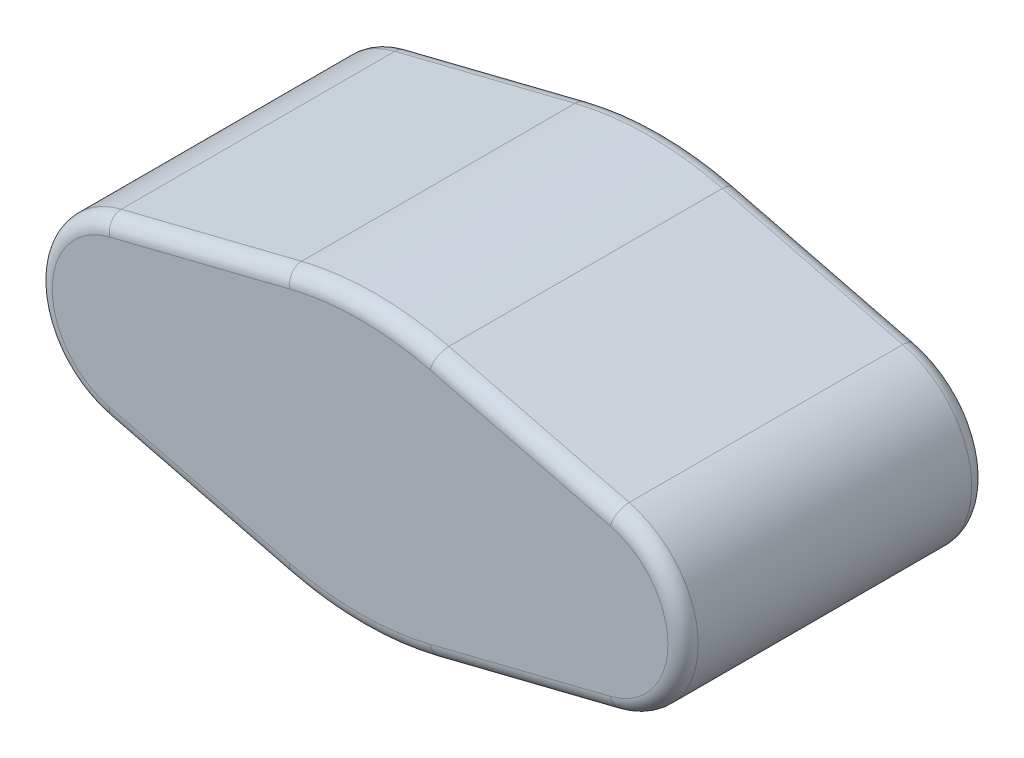
ISO-10303-21;
HEADER;
FILE_DESCRIPTION(('STEP AP214'),'2;1');
FILE_NAME('part.step','',(''),(''),'','','');
FILE_SCHEMA(('AUTOMOTIVE_DESIGN { 1 0 10303 214 1 1 1 1 }'));
ENDSEC;
DATA;
#1=APPLICATION_CONTEXT('core data for automotive mechanical design processes');
#2=APPLICATION_PROTOCOL_DEFINITION('international standard','automotive_design',2000,#1);
#3=PRODUCT_CONTEXT('',#1,'mechanical');
#4=PRODUCT('Part','Part','',(#3));
#5=PRODUCT_RELATED_PRODUCT_CATEGORY('part','',(#4));
#6=PRODUCT_DEFINITION_FORMATION('','',#4);
#7=PRODUCT_DEFINITION_CONTEXT('part definition',#1,'design');
#8=PRODUCT_DEFINITION('design','',#6,#7);
#9=PRODUCT_DEFINITION_SHAPE('','',#8);
#10=(LENGTH_UNIT() NAMED_UNIT(*) SI_UNIT(.MILLI.,.METRE.));
#11=(NAMED_UNIT(*) PLANE_ANGLE_UNIT() SI_UNIT($,.RADIAN.));
#12=(NAMED_UNIT(*) SI_UNIT($,.STERADIAN.) SOLID_ANGLE_UNIT());
#13=UNCERTAINTY_MEASURE_WITH_UNIT(LENGTH_MEASURE(1.E-05),#10,'distance_accuracy_value','');
#14=(GEOMETRIC_REPRESENTATION_CONTEXT(3) GLOBAL_UNCERTAINTY_ASSIGNED_CONTEXT((#13)) GLOBAL_UNIT_ASSIGNED_CONTEXT((#10,
#11,#12)) REPRESENTATION_CONTEXT('',''));
#15=CARTESIAN_POINT('',(0.,0.,0.));
#16=DIRECTION('',(0.,0.,1.));
#17=DIRECTION('',(1.,0.,0.));
#18=AXIS2_PLACEMENT_3D('',#15,#16,#17);
#19=CARTESIAN_POINT('',(0.,0.,0.));
#20=DIRECTION('',(0.,0.,1.));
#21=DIRECTION('',(1.,0.,0.));
#22=AXIS2_PLACEMENT_3D('',#19,#20,#21);
#23=PLANE('',#22);
#24=DIRECTION('',(-0.970142500145332,0.242535625036333,0.));
#25=VECTOR('',#24,1.);
#26=CARTESIAN_POINT('',(-0.121267812518166,-0.485071250072665,0.));
#27=LINE('',#26,#25);
#28=CARTESIAN_POINT('',(2.30408843784516,-1.0914103126635,0.));
#29=VERTEX_POINT('',#28);
#30=CARTESIAN_POINT('',(8.23702218573785,-2.57464374963667,0.));
#31=VERTEX_POINT('',#30);
#32=EDGE_CURVE('E153',#29,#31,#27,.F.);
#33=ORIENTED_EDGE('',*,*,#32,.T.);
#34=CARTESIAN_POINT('',(7.63068312314702,-5.,0.));
#35=DIRECTION('',(0.,0.,1.));
#36=DIRECTION('',(1.,0.,0.));
#37=AXIS2_PLACEMENT_3D('',#34,#35,#36);
#38=CIRCLE('',#37,2.5);
#39=CARTESIAN_POINT('',(8.23702218573785,-7.42535625036333,0.));
#40=VERTEX_POINT('',#39);
#41=EDGE_CURVE('E190',#31,#40,#38,.F.);
#42=ORIENTED_EDGE('',*,*,#41,.T.);
#43=DIRECTION('',(0.970142500145332,0.242535625036333,0.));
#44=VECTOR('',#43,1.);
#45=CARTESIAN_POINT('',(2.23167336395242,-8.92669345580969,0.));
#46=LINE('',#45,#44);
#47=CARTESIAN_POINT('',(2.30408843784516,-8.9085896873365,0.));
#48=VERTEX_POINT('',#47);
#49=EDGE_CURVE('E188',#40,#48,#46,.F.);
#50=ORIENTED_EDGE('',*,*,#49,.T.);
#51=CARTESIAN_POINT('',(0.,0.307764064044152,0.));
#52=DIRECTION('',(0.,0.,1.));
#53=DIRECTION('',(1.,0.,0.));
#54=AXIS2_PLACEMENT_3D('',#51,#52,#53);
#55=CIRCLE('',#54,9.5);
#56=CARTESIAN_POINT('',(-2.30408843784516,-8.9085896873365,0.));
#57=VERTEX_POINT('',#56);
#58=EDGE_CURVE('E186',#48,#57,#55,.F.);
#59=ORIENTED_EDGE('',*,*,#58,.T.);
#60=DIRECTION('',(0.970142500145332,-0.242535625036333,0.));
#61=VECTOR('',#60,1.);
#62=CARTESIAN_POINT('',(-2.23167336395242,-8.92669345580969,0.));
#63=LINE('',#62,#61);
#64=CARTESIAN_POINT('',(-8.23702218573785,-7.42535625036333,0.));
#65=VERTEX_POINT('',#64);
#66=EDGE_CURVE('E184',#57,#65,#63,.F.);
#67=ORIENTED_EDGE('',*,*,#66,.T.);
#68=CARTESIAN_POINT('',(-7.63068312314702,-5.,0.));
#69=DIRECTION('',(0.,0.,1.));
#70=DIRECTION('',(1.,0.,0.));
#71=AXIS2_PLACEMENT_3D('',#68,#69,#70);
#72=CIRCLE('',#71,2.5);
#73=CARTESIAN_POINT('',(-8.23702218573785,-2.57464374963667,0.));
#74=VERTEX_POINT('',#73);
#75=EDGE_CURVE('E182',#65,#74,#72,.F.);
#76=ORIENTED_EDGE('',*,*,#75,.T.);
#77=DIRECTION('',(-0.970142500145332,-0.242535625036333,0.));
#78=VECTOR('',#77,1.);
#79=CARTESIAN_POINT('',(0.121267812518166,-0.485071250072666,0.));
#80=LINE('',#79,#78);
#81=CARTESIAN_POINT('',(-2.30408843784517,-1.0914103126635,0.));
#82=VERTEX_POINT('',#81);
#83=EDGE_CURVE('E156',#74,#82,#80,.F.);
#84=ORIENTED_EDGE('',*,*,#83,.T.);
#85=CARTESIAN_POINT('',(0.,-10.3077640640442,0.));
#86=DIRECTION('',(0.,0.,1.));
#87=DIRECTION('',(1.,0.,0.));
#88=AXIS2_PLACEMENT_3D('',#85,#86,#87);
#89=CIRCLE('',#88,9.5);
#90=EDGE_CURVE('E148',#82,#29,#89,.F.);
#91=ORIENTED_EDGE('',*,*,#90,.T.);
#92=EDGE_LOOP('',(#33,#42,#50,#59,#67,#76,#84,#91));
#93=FACE_BOUND('',#92,.T.);
#94=CARTESIAN_POINT('',(0.,-5.,0.));
#95=DIRECTION('',(0.,0.,1.));
#96=DIRECTION('',(1.,0.,0.));
#97=AXIS2_PLACEMENT_3D('',#94,#95,#96);
#98=CIRCLE('',#97,3.);
#99=CARTESIAN_POINT('',(3.,-5.,0.));
#100=VERTEX_POINT('',#99);
#101=EDGE_CURVE('E174',#100,#100,#98,.F.);
#102=ORIENTED_EDGE('',*,*,#101,.F.);
#103=EDGE_LOOP('',(#102));
#104=FACE_BOUND('',#103,.T.);
#105=ADVANCED_FACE('F35',(#93,#104),#23,.F.);
#106=CARTESIAN_POINT('',(20.,-5.,10.));
#107=DIRECTION('',(-0.242535625036333,-0.970142500145332,0.));
#108=DIRECTION('',(0.970142500145332,-0.242535625036333,0.));
#109=AXIS2_PLACEMENT_3D('',#106,#107,#108);
#110=PLANE('',#109);
#111=DIRECTION('',(0.,0.,-1.));
#112=VECTOR('',#111,1.);
#113=CARTESIAN_POINT('',(8.35828999825602,-2.089572499564,10.));
#114=LINE('',#113,#112);
#115=CARTESIAN_POINT('',(8.35828999825602,-2.089572499564,9.5));
#116=VERTEX_POINT('',#115);
#117=CARTESIAN_POINT('',(8.35828999825602,-2.089572499564,0.5));
#118=VERTEX_POINT('',#117);
#119=EDGE_CURVE('E301',#116,#118,#114,.T.);
#120=ORIENTED_EDGE('',*,*,#119,.T.);
#121=DIRECTION('',(-0.970142500145332,0.242535625036333,0.));
#122=VECTOR('',#121,1.);
#123=CARTESIAN_POINT('',(20.,-5.,0.5));
#124=LINE('',#123,#122);
#125=CARTESIAN_POINT('',(2.42535625036333,-0.606339062590832,0.5));
#126=VERTEX_POINT('',#125);
#127=EDGE_CURVE('E11',#118,#126,#124,.T.);
#128=ORIENTED_EDGE('',*,*,#127,.T.);
#129=DIRECTION('',(0.,0.,-1.));
#130=VECTOR('',#129,1.);
#131=CARTESIAN_POINT('',(2.42535625036333,-0.606339062590832,10.));
#132=LINE('',#131,#130);
#133=CARTESIAN_POINT('',(2.42535625036333,-0.606339062590832,9.5));
#134=VERTEX_POINT('',#133);
#135=EDGE_CURVE('E304',#126,#134,#132,.F.);
#136=ORIENTED_EDGE('',*,*,#135,.T.);
#137=DIRECTION('',(-0.970142500145332,0.242535625036333,0.));
#138=VECTOR('',#137,1.);
#139=CARTESIAN_POINT('',(8.35828999825602,-2.08957249956401,9.5));
#140=LINE('',#139,#138);
#141=EDGE_CURVE('E44',#134,#116,#140,.F.);
#142=ORIENTED_EDGE('',*,*,#141,.T.);
#143=EDGE_LOOP('',(#120,#128,#136,#142));
#144=FACE_BOUND('',#143,.T.);
#145=ADVANCED_FACE('F326',(#144),#110,.F.);
#146=CARTESIAN_POINT('',(0.,0.,10.));
#147=DIRECTION('',(0.242535625036333,-0.970142500145332,0.));
#148=DIRECTION('',(0.970142500145332,0.242535625036333,0.));
#149=AXIS2_PLACEMENT_3D('',#146,#147,#148);
#150=PLANE('',#149);
#151=DIRECTION('',(0.,0.,-1.));
#152=VECTOR('',#151,1.);
#153=CARTESIAN_POINT('',(-2.42535625036333,-0.606339062590833,10.));
#154=LINE('',#153,#152);
#155=CARTESIAN_POINT('',(-2.42535625036333,-0.606339062590833,9.5));
#156=VERTEX_POINT('',#155);
#157=CARTESIAN_POINT('',(-2.42535625036333,-0.606339062590833,0.5));
#158=VERTEX_POINT('',#157);
#159=EDGE_CURVE('E307',#156,#158,#154,.T.);
#160=ORIENTED_EDGE('',*,*,#159,.T.);
#161=DIRECTION('',(-0.970142500145332,-0.242535625036333,0.));
#162=VECTOR('',#161,1.);
#163=CARTESIAN_POINT('',(0.,0.,0.5));
#164=LINE('',#163,#162);
#165=CARTESIAN_POINT('',(-8.35828999825602,-2.089572499564,0.5));
#166=VERTEX_POINT('',#165);
#167=EDGE_CURVE('E216',#158,#166,#164,.T.);
#168=ORIENTED_EDGE('',*,*,#167,.T.);
#169=DIRECTION('',(0.,0.,-1.));
#170=VECTOR('',#169,1.);
#171=CARTESIAN_POINT('',(-8.35828999825602,-2.089572499564,10.));
#172=LINE('',#171,#170);
#173=CARTESIAN_POINT('',(-8.35828999825602,-2.089572499564,9.5));
#174=VERTEX_POINT('',#173);
#175=EDGE_CURVE('E177',#166,#174,#172,.F.);
#176=ORIENTED_EDGE('',*,*,#175,.T.);
#177=DIRECTION('',(-0.970142500145332,-0.242535625036333,0.));
#178=VECTOR('',#177,1.);
#179=CARTESIAN_POINT('',(-2.42535625036333,-0.606339062590833,9.5));
#180=LINE('',#179,#178);
#181=EDGE_CURVE('E214',#174,#156,#180,.F.);
#182=ORIENTED_EDGE('',*,*,#181,.T.);
#183=EDGE_LOOP('',(#160,#168,#176,#182));
#184=FACE_BOUND('',#183,.T.);
#185=ADVANCED_FACE('F293',(#184),#150,.F.);
#186=CARTESIAN_POINT('',(-20.,-5.,10.));
#187=DIRECTION('',(0.242535625036333,0.970142500145332,0.));
#188=DIRECTION('',(-0.970142500145332,0.242535625036333,0.));
#189=AXIS2_PLACEMENT_3D('',#186,#187,#188);
#190=PLANE('',#189);
#191=DIRECTION('',(0.,0.,-1.));
#192=VECTOR('',#191,1.);
#193=CARTESIAN_POINT('',(-8.35828999825602,-7.910427500436,10.));
#194=LINE('',#193,#192);
#195=CARTESIAN_POINT('',(-8.35828999825602,-7.910427500436,9.5));
#196=VERTEX_POINT('',#195);
#197=CARTESIAN_POINT('',(-8.35828999825602,-7.910427500436,0.5));
#198=VERTEX_POINT('',#197);
#199=EDGE_CURVE('E290',#196,#198,#194,.T.);
#200=ORIENTED_EDGE('',*,*,#199,.T.);
#201=DIRECTION('',(0.970142500145332,-0.242535625036333,0.));
#202=VECTOR('',#201,1.);
#203=CARTESIAN_POINT('',(-20.,-5.,0.5));
#204=LINE('',#203,#202);
#205=CARTESIAN_POINT('',(-2.42535625036333,-9.39366093740917,0.5));
#206=VERTEX_POINT('',#205);
#207=EDGE_CURVE('E208',#198,#206,#204,.T.);
#208=ORIENTED_EDGE('',*,*,#207,.T.);
#209=DIRECTION('',(0.,0.,-1.));
#210=VECTOR('',#209,1.);
#211=CARTESIAN_POINT('',(-2.42535625036333,-9.39366093740917,10.));
#212=LINE('',#211,#210);
#213=CARTESIAN_POINT('',(-2.42535625036333,-9.39366093740917,9.5));
#214=VERTEX_POINT('',#213);
#215=EDGE_CURVE('E309',#206,#214,#212,.F.);
#216=ORIENTED_EDGE('',*,*,#215,.T.);
#217=DIRECTION('',(0.970142500145332,-0.242535625036333,0.));
#218=VECTOR('',#217,1.);
#219=CARTESIAN_POINT('',(-8.35828999825602,-7.91042750043599,9.5));
#220=LINE('',#219,#218);
#221=EDGE_CURVE('E206',#214,#196,#220,.F.);
#222=ORIENTED_EDGE('',*,*,#221,.T.);
#223=EDGE_LOOP('',(#200,#208,#216,#222));
#224=FACE_BOUND('',#223,.T.);
#225=ADVANCED_FACE('F339',(#224),#190,.F.);
#226=CARTESIAN_POINT('',(0.,-10.,10.));
#227=DIRECTION('',(-0.242535625036333,0.970142500145332,0.));
#228=DIRECTION('',(-0.970142500145332,-0.242535625036333,0.));
#229=AXIS2_PLACEMENT_3D('',#226,#227,#228);
#230=PLANE('',#229);
#231=DIRECTION('',(0.,0.,-1.));
#232=VECTOR('',#231,1.);
#233=CARTESIAN_POINT('',(2.42535625036333,-9.39366093740917,10.));
#234=LINE('',#233,#232);
#235=CARTESIAN_POINT('',(2.42535625036333,-9.39366093740917,9.5));
#236=VERTEX_POINT('',#235);
#237=CARTESIAN_POINT('',(2.42535625036333,-9.39366093740917,0.5));
#238=VERTEX_POINT('',#237);
#239=EDGE_CURVE('E312',#236,#238,#234,.T.);
#240=ORIENTED_EDGE('',*,*,#239,.T.);
#241=DIRECTION('',(0.970142500145332,0.242535625036333,0.));
#242=VECTOR('',#241,1.);
#243=CARTESIAN_POINT('',(0.,-10.,0.5));
#244=LINE('',#243,#242);
#245=CARTESIAN_POINT('',(8.35828999825602,-7.910427500436,0.5));
#246=VERTEX_POINT('',#245);
#247=EDGE_CURVE('E200',#238,#246,#244,.T.);
#248=ORIENTED_EDGE('',*,*,#247,.T.);
#249=DIRECTION('',(0.,0.,-1.));
#250=VECTOR('',#249,1.);
#251=CARTESIAN_POINT('',(8.35828999825602,-7.910427500436,10.));
#252=LINE('',#251,#250);
#253=CARTESIAN_POINT('',(8.35828999825602,-7.910427500436,9.5));
#254=VERTEX_POINT('',#253);
#255=EDGE_CURVE('E296',#246,#254,#252,.F.);
#256=ORIENTED_EDGE('',*,*,#255,.T.);
#257=DIRECTION('',(0.970142500145332,0.242535625036333,0.));
#258=VECTOR('',#257,1.);
#259=CARTESIAN_POINT('',(2.42535625036333,-9.39366093740917,9.5));
#260=LINE('',#259,#258);
#261=EDGE_CURVE('E198',#254,#236,#260,.F.);
#262=ORIENTED_EDGE('',*,*,#261,.T.);
#263=EDGE_LOOP('',(#240,#248,#256,#262));
#264=FACE_BOUND('',#263,.T.);
#265=ADVANCED_FACE('F336',(#264),#230,.F.);
#266=CARTESIAN_POINT('',(0.,0.,10.));
#267=DIRECTION('',(0.,0.,1.));
#268=DIRECTION('',(1.,0.,0.));
#269=AXIS2_PLACEMENT_3D('',#266,#267,#268);
#270=PLANE('',#269);
#271=DIRECTION('',(0.970142500145332,0.242535625036333,0.));
#272=VECTOR('',#271,1.);
#273=CARTESIAN_POINT('',(8.23702218573785,-7.42535625036333,10.));
#274=LINE('',#273,#272);
#275=CARTESIAN_POINT('',(2.30408843784516,-8.9085896873365,10.));
#276=VERTEX_POINT('',#275);
#277=CARTESIAN_POINT('',(8.23702218573785,-7.42535625036333,10.));
#278=VERTEX_POINT('',#277);
#279=EDGE_CURVE('E52',#276,#278,#274,.T.);
#280=ORIENTED_EDGE('',*,*,#279,.T.);
#281=CARTESIAN_POINT('',(7.63068312314702,-5.,10.));
#282=DIRECTION('',(0.,0.,1.));
#283=DIRECTION('',(1.,0.,0.));
#284=AXIS2_PLACEMENT_3D('',#281,#282,#283);
#285=CIRCLE('',#284,2.5);
#286=CARTESIAN_POINT('',(8.23702218573785,-2.57464374963667,10.));
#287=VERTEX_POINT('',#286);
#288=EDGE_CURVE('E233',#278,#287,#285,.T.);
#289=ORIENTED_EDGE('',*,*,#288,.T.);
#290=DIRECTION('',(-0.970142500145332,0.242535625036333,0.));
#291=VECTOR('',#290,1.);
#292=CARTESIAN_POINT('',(2.30408843784517,-1.0914103126635,10.));
#293=LINE('',#292,#291);
#294=CARTESIAN_POINT('',(2.30408843784516,-1.0914103126635,10.));
#295=VERTEX_POINT('',#294);
#296=EDGE_CURVE('E221',#287,#295,#293,.T.);
#297=ORIENTED_EDGE('',*,*,#296,.T.);
#298=CARTESIAN_POINT('',(0.,-10.3077640640442,10.));
#299=DIRECTION('',(0.,0.,1.));
#300=DIRECTION('',(1.,0.,0.));
#301=AXIS2_PLACEMENT_3D('',#298,#299,#300);
#302=CIRCLE('',#301,9.5);
#303=CARTESIAN_POINT('',(-2.30408843784517,-1.0914103126635,10.));
#304=VERTEX_POINT('',#303);
#305=EDGE_CURVE('E223',#295,#304,#302,.T.);
#306=ORIENTED_EDGE('',*,*,#305,.T.);
#307=DIRECTION('',(-0.970142500145332,-0.242535625036333,0.));
#308=VECTOR('',#307,1.);
#309=CARTESIAN_POINT('',(-8.23702218573785,-2.57464374963667,10.));
#310=LINE('',#309,#308);
#311=CARTESIAN_POINT('',(-8.23702218573785,-2.57464374963667,10.));
#312=VERTEX_POINT('',#311);
#313=EDGE_CURVE('E225',#304,#312,#310,.T.);
#314=ORIENTED_EDGE('',*,*,#313,.T.);
#315=CARTESIAN_POINT('',(-7.63068312314702,-5.,10.));
#316=DIRECTION('',(0.,0.,1.));
#317=DIRECTION('',(1.,0.,0.));
#318=AXIS2_PLACEMENT_3D('',#315,#316,#317);
#319=CIRCLE('',#318,2.5);
#320=CARTESIAN_POINT('',(-8.23702218573785,-7.42535625036333,10.));
#321=VERTEX_POINT('',#320);
#322=EDGE_CURVE('E227',#312,#321,#319,.T.);
#323=ORIENTED_EDGE('',*,*,#322,.T.);
#324=DIRECTION('',(0.970142500145332,-0.242535625036333,0.));
#325=VECTOR('',#324,1.);
#326=CARTESIAN_POINT('',(-2.30408843784517,-8.9085896873365,10.));
#327=LINE('',#326,#325);
#328=CARTESIAN_POINT('',(-2.30408843784516,-8.9085896873365,10.));
#329=VERTEX_POINT('',#328);
#330=EDGE_CURVE('E229',#321,#329,#327,.T.);
#331=ORIENTED_EDGE('',*,*,#330,.T.);
#332=CARTESIAN_POINT('',(0.,0.307764064044152,10.));
#333=DIRECTION('',(0.,0.,1.));
#334=DIRECTION('',(1.,0.,0.));
#335=AXIS2_PLACEMENT_3D('',#332,#333,#334);
#336=CIRCLE('',#335,9.5);
#337=EDGE_CURVE('E57',#329,#276,#336,.T.);
#338=ORIENTED_EDGE('',*,*,#337,.T.);
#339=EDGE_LOOP('',(#280,#289,#297,#306,#314,#323,#331,#338));
#340=FACE_BOUND('',#339,.T.);
#341=ADVANCED_FACE('F335',(#340),#270,.T.);
#342=CARTESIAN_POINT('',(0.,0.307764064044152,10.));
#343=DIRECTION('',(0.,0.,-1.));
#344=DIRECTION('',(-1.,0.,0.));
#345=AXIS2_PLACEMENT_3D('',#342,#343,#344);
#346=CYLINDRICAL_SURFACE('',#345,10.);
#347=ORIENTED_EDGE('',*,*,#215,.F.);
#348=CARTESIAN_POINT('',(0.,0.307764064044152,0.5));
#349=DIRECTION('',(0.,0.,1.));
#350=DIRECTION('',(1.,0.,0.));
#351=AXIS2_PLACEMENT_3D('',#348,#349,#350);
#352=CIRCLE('',#351,10.);
#353=EDGE_CURVE('E204',#206,#238,#352,.T.);
#354=ORIENTED_EDGE('',*,*,#353,.T.);
#355=ORIENTED_EDGE('',*,*,#239,.F.);
#356=CARTESIAN_POINT('',(0.,0.307764064044152,9.5));
#357=DIRECTION('',(0.,0.,1.));
#358=DIRECTION('',(1.,0.,0.));
#359=AXIS2_PLACEMENT_3D('',#356,#357,#358);
#360=CIRCLE('',#359,10.);
#361=EDGE_CURVE('E202',#236,#214,#360,.F.);
#362=ORIENTED_EDGE('',*,*,#361,.T.);
#363=EDGE_LOOP('',(#347,#354,#355,#362));
#364=FACE_BOUND('',#363,.T.);
#365=ADVANCED_FACE('F346',(#364),#346,.T.);
#366=CARTESIAN_POINT('',(0.,-10.3077640640442,10.));
#367=DIRECTION('',(0.,0.,-1.));
#368=DIRECTION('',(-1.,0.,0.));
#369=AXIS2_PLACEMENT_3D('',#366,#367,#368);
#370=CYLINDRICAL_SURFACE('',#369,10.);
#371=ORIENTED_EDGE('',*,*,#135,.F.);
#372=CARTESIAN_POINT('',(0.,-10.3077640640442,0.5));
#373=DIRECTION('',(0.,0.,1.));
#374=DIRECTION('',(1.,0.,0.));
#375=AXIS2_PLACEMENT_3D('',#372,#373,#374);
#376=CIRCLE('',#375,10.);
#377=EDGE_CURVE('E165',#126,#158,#376,.T.);
#378=ORIENTED_EDGE('',*,*,#377,.T.);
#379=ORIENTED_EDGE('',*,*,#159,.F.);
#380=CARTESIAN_POINT('',(0.,-10.3077640640442,9.5));
#381=DIRECTION('',(0.,0.,1.));
#382=DIRECTION('',(1.,0.,0.));
#383=AXIS2_PLACEMENT_3D('',#380,#381,#382);
#384=CIRCLE('',#383,10.);
#385=EDGE_CURVE('E218',#156,#134,#384,.F.);
#386=ORIENTED_EDGE('',*,*,#385,.T.);
#387=EDGE_LOOP('',(#371,#378,#379,#386));
#388=FACE_BOUND('',#387,.T.);
#389=ADVANCED_FACE('F349',(#388),#370,.T.);
#390=CARTESIAN_POINT('',(7.63068312314702,-5.,10.));
#391=DIRECTION('',(0.,0.,-1.));
#392=DIRECTION('',(-1.,0.,0.));
#393=AXIS2_PLACEMENT_3D('',#390,#391,#392);
#394=CYLINDRICAL_SURFACE('',#393,3.);
#395=ORIENTED_EDGE('',*,*,#255,.F.);
#396=CARTESIAN_POINT('',(7.63068312314702,-5.,0.5));
#397=DIRECTION('',(0.,0.,1.));
#398=DIRECTION('',(1.,0.,0.));
#399=AXIS2_PLACEMENT_3D('',#396,#397,#398);
#400=CIRCLE('',#399,3.);
#401=EDGE_CURVE('E195',#246,#118,#400,.T.);
#402=ORIENTED_EDGE('',*,*,#401,.T.);
#403=ORIENTED_EDGE('',*,*,#119,.F.);
#404=CARTESIAN_POINT('',(7.63068312314702,-5.,9.5));
#405=DIRECTION('',(0.,0.,1.));
#406=DIRECTION('',(1.,0.,0.));
#407=AXIS2_PLACEMENT_3D('',#404,#405,#406);
#408=CIRCLE('',#407,3.);
#409=EDGE_CURVE('E192',#116,#254,#408,.F.);
#410=ORIENTED_EDGE('',*,*,#409,.T.);
#411=EDGE_LOOP('',(#395,#402,#403,#410));
#412=FACE_BOUND('',#411,.T.);
#413=ADVANCED_FACE('F353',(#412),#394,.T.);
#414=CARTESIAN_POINT('',(-7.63068312314702,-5.,10.));
#415=DIRECTION('',(0.,0.,-1.));
#416=DIRECTION('',(-1.,0.,0.));
#417=AXIS2_PLACEMENT_3D('',#414,#415,#416);
#418=CYLINDRICAL_SURFACE('',#417,3.);
#419=ORIENTED_EDGE('',*,*,#175,.F.);
#420=CARTESIAN_POINT('',(-7.63068312314702,-5.,0.5));
#421=DIRECTION('',(0.,0.,1.));
#422=DIRECTION('',(1.,0.,0.));
#423=AXIS2_PLACEMENT_3D('',#420,#421,#422);
#424=CIRCLE('',#423,3.);
#425=EDGE_CURVE('E212',#166,#198,#424,.T.);
#426=ORIENTED_EDGE('',*,*,#425,.T.);
#427=ORIENTED_EDGE('',*,*,#199,.F.);
#428=CARTESIAN_POINT('',(-7.63068312314702,-5.,9.5));
#429=DIRECTION('',(0.,0.,1.));
#430=DIRECTION('',(1.,0.,0.));
#431=AXIS2_PLACEMENT_3D('',#428,#429,#430);
#432=CIRCLE('',#431,3.);
#433=EDGE_CURVE('E210',#196,#174,#432,.F.);
#434=ORIENTED_EDGE('',*,*,#433,.T.);
#435=EDGE_LOOP('',(#419,#426,#427,#434));
#436=FACE_BOUND('',#435,.T.);
#437=ADVANCED_FACE('F287',(#436),#418,.T.);
#438=CARTESIAN_POINT('',(0.,-5.,-1.));
#439=DIRECTION('',(0.,0.,1.));
#440=DIRECTION('',(1.,0.,0.));
#441=AXIS2_PLACEMENT_3D('',#438,#439,#440);
#442=CYLINDRICAL_SURFACE('',#441,3.);
#443=CARTESIAN_POINT('',(0.,-5.,-1.));
#444=DIRECTION('',(0.,0.,-1.));
#445=DIRECTION('',(-1.,0.,0.));
#446=AXIS2_PLACEMENT_3D('',#443,#444,#445);
#447=CIRCLE('',#446,3.);
#448=CARTESIAN_POINT('',(-3.,-5.,-1.));
#449=VERTEX_POINT('',#448);
#450=EDGE_CURVE('E251',#449,#449,#447,.T.);
#451=ORIENTED_EDGE('',*,*,#450,.F.);
#452=EDGE_LOOP('',(#451));
#453=FACE_BOUND('',#452,.T.);
#454=ORIENTED_EDGE('',*,*,#101,.T.);
#455=EDGE_LOOP('',(#454));
#456=FACE_BOUND('',#455,.T.);
#457=ADVANCED_FACE('F320',(#453,#456),#442,.T.);
#458=CARTESIAN_POINT('',(0.,-5.,-1.));
#459=DIRECTION('',(0.,0.,-1.));
#460=DIRECTION('',(-1.,0.,0.));
#461=AXIS2_PLACEMENT_3D('',#458,#459,#460);
#462=PLANE('',#461);
#463=ORIENTED_EDGE('',*,*,#450,.T.);
#464=EDGE_LOOP('',(#463));
#465=FACE_BOUND('',#464,.T.);
#466=ADVANCED_FACE('F318',(#465),#462,.T.);
#467=CARTESIAN_POINT('',(-7.63068312314702,-5.,0.5));
#468=DIRECTION('',(0.,0.,1.));
#469=DIRECTION('',(1.,0.,0.));
#470=AXIS2_PLACEMENT_3D('',#467,#468,#469);
#471=TOROIDAL_SURFACE('',#470,2.5,0.5);
#472=CARTESIAN_POINT('',(-8.23702218573785,-7.42535625036333,0.5));
#473=DIRECTION('',(0.970142500145332,-0.242535625036334,0.));
#474=DIRECTION('',(0.242535625036334,0.970142500145332,0.));
#475=AXIS2_PLACEMENT_3D('',#472,#473,#474);
#476=CIRCLE('',#475,0.5);
#477=EDGE_CURVE('E245',#198,#65,#476,.T.);
#478=ORIENTED_EDGE('',*,*,#477,.F.);
#479=ORIENTED_EDGE('',*,*,#425,.F.);
#480=CARTESIAN_POINT('',(-8.23702218573785,-2.57464374963667,0.5));
#481=DIRECTION('',(0.970142500145332,0.242535625036334,0.));
#482=DIRECTION('',(-0.242535625036334,0.970142500145332,0.));
#483=AXIS2_PLACEMENT_3D('',#480,#481,#482);
#484=CIRCLE('',#483,0.5);
#485=EDGE_CURVE('E248',#74,#166,#484,.T.);
#486=ORIENTED_EDGE('',*,*,#485,.F.);
#487=ORIENTED_EDGE('',*,*,#75,.F.);
#488=EDGE_LOOP('',(#478,#479,#486,#487));
#489=FACE_BOUND('',#488,.T.);
#490=ADVANCED_FACE('F383',(#489),#471,.T.);
#491=CARTESIAN_POINT('',(0.121267812518167,-0.485071250072666,0.5));
#492=DIRECTION('',(-0.970142500145332,-0.242535625036333,0.));
#493=DIRECTION('',(0.242535625036333,-0.970142500145332,0.));
#494=AXIS2_PLACEMENT_3D('',#491,#492,#493);
#495=CYLINDRICAL_SURFACE('',#494,0.5);
#496=ORIENTED_EDGE('',*,*,#485,.T.);
#497=ORIENTED_EDGE('',*,*,#167,.F.);
#498=CARTESIAN_POINT('',(-2.30408843784517,-1.0914103126635,0.5));
#499=DIRECTION('',(0.970142500145332,0.242535625036333,0.));
#500=DIRECTION('',(-0.242535625036333,0.970142500145332,0.));
#501=AXIS2_PLACEMENT_3D('',#498,#499,#500);
#502=CIRCLE('',#501,0.5);
#503=EDGE_CURVE('E243',#82,#158,#502,.T.);
#504=ORIENTED_EDGE('',*,*,#503,.F.);
#505=ORIENTED_EDGE('',*,*,#83,.F.);
#506=EDGE_LOOP('',(#496,#497,#504,#505));
#507=FACE_BOUND('',#506,.T.);
#508=ADVANCED_FACE('F379',(#507),#495,.T.);
#509=CARTESIAN_POINT('',(-19.8787321874818,-4.51492874992733,0.5));
#510=DIRECTION('',(0.970142500145332,-0.242535625036333,0.));
#511=DIRECTION('',(0.242535625036333,0.970142500145332,0.));
#512=AXIS2_PLACEMENT_3D('',#509,#510,#511);
#513=CYLINDRICAL_SURFACE('',#512,0.5);
#514=ORIENTED_EDGE('',*,*,#477,.T.);
#515=ORIENTED_EDGE('',*,*,#66,.F.);
#516=CARTESIAN_POINT('',(-2.30408843784516,-8.9085896873365,0.5));
#517=DIRECTION('',(0.970142500145332,-0.242535625036333,0.));
#518=DIRECTION('',(0.242535625036333,0.970142500145332,0.));
#519=AXIS2_PLACEMENT_3D('',#516,#517,#518);
#520=CIRCLE('',#519,0.5);
#521=EDGE_CURVE('E168',#206,#57,#520,.T.);
#522=ORIENTED_EDGE('',*,*,#521,.F.);
#523=ORIENTED_EDGE('',*,*,#207,.F.);
#524=EDGE_LOOP('',(#514,#515,#522,#523));
#525=FACE_BOUND('',#524,.T.);
#526=ADVANCED_FACE('F376',(#525),#513,.T.);
#527=CARTESIAN_POINT('',(0.,-10.3077640640442,0.5));
#528=DIRECTION('',(0.,0.,1.));
#529=DIRECTION('',(1.,0.,0.));
#530=AXIS2_PLACEMENT_3D('',#527,#528,#529);
#531=TOROIDAL_SURFACE('',#530,9.5,0.5);
#532=ORIENTED_EDGE('',*,*,#503,.T.);
#533=ORIENTED_EDGE('',*,*,#377,.F.);
#534=CARTESIAN_POINT('',(2.30408843784516,-1.0914103126635,0.5));
#535=DIRECTION('',(0.970142500145332,-0.242535625036333,0.));
#536=DIRECTION('',(0.242535625036333,0.970142500145332,0.));
#537=AXIS2_PLACEMENT_3D('',#534,#535,#536);
#538=CIRCLE('',#537,0.5);
#539=EDGE_CURVE('E163',#29,#126,#538,.T.);
#540=ORIENTED_EDGE('',*,*,#539,.F.);
#541=ORIENTED_EDGE('',*,*,#90,.F.);
#542=EDGE_LOOP('',(#532,#533,#540,#541));
#543=FACE_BOUND('',#542,.T.);
#544=ADVANCED_FACE('F164',(#543),#531,.T.);
#545=CARTESIAN_POINT('',(0.,0.307764064044152,0.5));
#546=DIRECTION('',(0.,0.,1.));
#547=DIRECTION('',(1.,0.,0.));
#548=AXIS2_PLACEMENT_3D('',#545,#546,#547);
#549=TOROIDAL_SURFACE('',#548,9.5,0.5);
#550=ORIENTED_EDGE('',*,*,#521,.T.);
#551=ORIENTED_EDGE('',*,*,#58,.F.);
#552=CARTESIAN_POINT('',(2.30408843784516,-8.9085896873365,0.5));
#553=DIRECTION('',(0.970142500145332,0.242535625036333,0.));
#554=DIRECTION('',(-0.242535625036333,0.970142500145332,0.));
#555=AXIS2_PLACEMENT_3D('',#552,#553,#554);
#556=CIRCLE('',#555,0.5);
#557=EDGE_CURVE('E169',#238,#48,#556,.T.);
#558=ORIENTED_EDGE('',*,*,#557,.F.);
#559=ORIENTED_EDGE('',*,*,#353,.F.);
#560=EDGE_LOOP('',(#550,#551,#558,#559));
#561=FACE_BOUND('',#560,.T.);
#562=ADVANCED_FACE('F370',(#561),#549,.T.);
#563=CARTESIAN_POINT('',(19.8787321874818,-5.48507125007267,0.5));
#564=DIRECTION('',(-0.970142500145332,0.242535625036333,0.));
#565=DIRECTION('',(-0.242535625036333,-0.970142500145332,0.));
#566=AXIS2_PLACEMENT_3D('',#563,#564,#565);
#567=CYLINDRICAL_SURFACE('',#566,0.5);
#568=ORIENTED_EDGE('',*,*,#539,.T.);
#569=ORIENTED_EDGE('',*,*,#127,.F.);
#570=CARTESIAN_POINT('',(8.23702218573785,-2.57464374963667,0.5));
#571=DIRECTION('',(0.970142500145332,-0.242535625036334,0.));
#572=DIRECTION('',(0.242535625036334,0.970142500145332,0.));
#573=AXIS2_PLACEMENT_3D('',#570,#571,#572);
#574=CIRCLE('',#573,0.5);
#575=EDGE_CURVE('E172',#31,#118,#574,.T.);
#576=ORIENTED_EDGE('',*,*,#575,.F.);
#577=ORIENTED_EDGE('',*,*,#32,.F.);
#578=EDGE_LOOP('',(#568,#569,#576,#577));
#579=FACE_BOUND('',#578,.T.);
#580=ADVANCED_FACE('F171',(#579),#567,.T.);
#581=CARTESIAN_POINT('',(-0.121267812518167,-9.51492874992733,0.5));
#582=DIRECTION('',(0.970142500145332,0.242535625036333,0.));
#583=DIRECTION('',(-0.242535625036333,0.970142500145332,0.));
#584=AXIS2_PLACEMENT_3D('',#581,#582,#583);
#585=CYLINDRICAL_SURFACE('',#584,0.5);
#586=ORIENTED_EDGE('',*,*,#557,.T.);
#587=ORIENTED_EDGE('',*,*,#49,.F.);
#588=CARTESIAN_POINT('',(8.23702218573785,-7.42535625036333,0.5));
#589=DIRECTION('',(0.970142500145332,0.242535625036334,0.));
#590=DIRECTION('',(-0.242535625036334,0.970142500145332,0.));
#591=AXIS2_PLACEMENT_3D('',#588,#589,#590);
#592=CIRCLE('',#591,0.5);
#593=EDGE_CURVE('E236',#246,#40,#592,.T.);
#594=ORIENTED_EDGE('',*,*,#593,.F.);
#595=ORIENTED_EDGE('',*,*,#247,.F.);
#596=EDGE_LOOP('',(#586,#587,#594,#595));
#597=FACE_BOUND('',#596,.T.);
#598=ADVANCED_FACE('F363',(#597),#585,.T.);
#599=CARTESIAN_POINT('',(7.63068312314702,-5.,0.5));
#600=DIRECTION('',(0.,0.,1.));
#601=DIRECTION('',(1.,0.,0.));
#602=AXIS2_PLACEMENT_3D('',#599,#600,#601);
#603=TOROIDAL_SURFACE('',#602,2.5,0.5);
#604=ORIENTED_EDGE('',*,*,#575,.T.);
#605=ORIENTED_EDGE('',*,*,#401,.F.);
#606=ORIENTED_EDGE('',*,*,#593,.T.);
#607=ORIENTED_EDGE('',*,*,#41,.F.);
#608=EDGE_LOOP('',(#604,#605,#606,#607));
#609=FACE_BOUND('',#608,.T.);
#610=ADVANCED_FACE('F360',(#609),#603,.T.);
#611=CARTESIAN_POINT('',(-7.63068312314702,-5.,9.5));
#612=DIRECTION('',(0.,0.,1.));
#613=DIRECTION('',(1.,0.,0.));
#614=AXIS2_PLACEMENT_3D('',#611,#612,#613);
#615=TOROIDAL_SURFACE('',#614,2.5,0.5);
#616=CARTESIAN_POINT('',(-8.23702218573785,-2.57464374963667,9.5));
#617=DIRECTION('',(0.970142500145332,0.242535625036334,0.));
#618=DIRECTION('',(-0.242535625036334,0.970142500145332,0.));
#619=AXIS2_PLACEMENT_3D('',#616,#617,#618);
#620=CIRCLE('',#619,0.5);
#621=EDGE_CURVE('E267',#174,#312,#620,.T.);
#622=ORIENTED_EDGE('',*,*,#621,.F.);
#623=ORIENTED_EDGE('',*,*,#433,.F.);
#624=CARTESIAN_POINT('',(-8.23702218573785,-7.42535625036333,9.5));
#625=DIRECTION('',(0.970142500145332,-0.242535625036333,0.));
#626=DIRECTION('',(0.242535625036333,0.970142500145332,0.));
#627=AXIS2_PLACEMENT_3D('',#624,#625,#626);
#628=CIRCLE('',#627,0.5);
#629=EDGE_CURVE('E39',#321,#196,#628,.T.);
#630=ORIENTED_EDGE('',*,*,#629,.F.);
#631=ORIENTED_EDGE('',*,*,#322,.F.);
#632=EDGE_LOOP('',(#622,#623,#630,#631));
#633=FACE_BOUND('',#632,.T.);
#634=ADVANCED_FACE('F37',(#633),#615,.T.);
#635=CARTESIAN_POINT('',(-2.23167336395242,-8.92669345580969,9.5));
#636=DIRECTION('',(-0.970142500145332,0.242535625036333,0.));
#637=DIRECTION('',(-0.242535625036333,-0.970142500145332,0.));
#638=AXIS2_PLACEMENT_3D('',#635,#636,#637);
#639=CYLINDRICAL_SURFACE('',#638,0.5);
#640=ORIENTED_EDGE('',*,*,#629,.T.);
#641=ORIENTED_EDGE('',*,*,#221,.F.);
#642=CARTESIAN_POINT('',(-2.30408843784516,-8.9085896873365,9.5));
#643=DIRECTION('',(0.970142500145332,-0.242535625036333,0.));
#644=DIRECTION('',(0.242535625036333,0.970142500145332,0.));
#645=AXIS2_PLACEMENT_3D('',#642,#643,#644);
#646=CIRCLE('',#645,0.5);
#647=EDGE_CURVE('E265',#329,#214,#646,.T.);
#648=ORIENTED_EDGE('',*,*,#647,.F.);
#649=ORIENTED_EDGE('',*,*,#330,.F.);
#650=EDGE_LOOP('',(#640,#641,#648,#649));
#651=FACE_BOUND('',#650,.T.);
#652=ADVANCED_FACE('F278',(#651),#639,.T.);
#653=CARTESIAN_POINT('',(0.121267812518167,-0.485071250072666,9.5));
#654=DIRECTION('',(0.970142500145332,0.242535625036333,0.));
#655=DIRECTION('',(-0.242535625036333,0.970142500145332,0.));
#656=AXIS2_PLACEMENT_3D('',#653,#654,#655);
#657=CYLINDRICAL_SURFACE('',#656,0.5);
#658=ORIENTED_EDGE('',*,*,#621,.T.);
#659=ORIENTED_EDGE('',*,*,#313,.F.);
#660=CARTESIAN_POINT('',(-2.30408843784517,-1.0914103126635,9.5));
#661=DIRECTION('',(0.970142500145332,0.242535625036333,0.));
#662=DIRECTION('',(-0.242535625036333,0.970142500145332,0.));
#663=AXIS2_PLACEMENT_3D('',#660,#661,#662);
#664=CIRCLE('',#663,0.5);
#665=EDGE_CURVE('E262',#156,#304,#664,.T.);
#666=ORIENTED_EDGE('',*,*,#665,.F.);
#667=ORIENTED_EDGE('',*,*,#181,.F.);
#668=EDGE_LOOP('',(#658,#659,#666,#667));
#669=FACE_BOUND('',#668,.T.);
#670=ADVANCED_FACE('F407',(#669),#657,.T.);
#671=CARTESIAN_POINT('',(0.,0.307764064044152,9.5));
#672=DIRECTION('',(0.,0.,1.));
#673=DIRECTION('',(1.,0.,0.));
#674=AXIS2_PLACEMENT_3D('',#671,#672,#673);
#675=TOROIDAL_SURFACE('',#674,9.5,0.5);
#676=ORIENTED_EDGE('',*,*,#647,.T.);
#677=ORIENTED_EDGE('',*,*,#361,.F.);
#678=CARTESIAN_POINT('',(2.30408843784516,-8.9085896873365,9.5));
#679=DIRECTION('',(0.970142500145332,0.242535625036333,0.));
#680=DIRECTION('',(-0.242535625036333,0.970142500145332,0.));
#681=AXIS2_PLACEMENT_3D('',#678,#679,#680);
#682=CIRCLE('',#681,0.5);
#683=EDGE_CURVE('E259',#276,#236,#682,.T.);
#684=ORIENTED_EDGE('',*,*,#683,.F.);
#685=ORIENTED_EDGE('',*,*,#337,.F.);
#686=EDGE_LOOP('',(#676,#677,#684,#685));
#687=FACE_BOUND('',#686,.T.);
#688=ADVANCED_FACE('F403',(#687),#675,.T.);
#689=CARTESIAN_POINT('',(0.,-10.3077640640442,9.5));
#690=DIRECTION('',(0.,0.,1.));
#691=DIRECTION('',(1.,0.,0.));
#692=AXIS2_PLACEMENT_3D('',#689,#690,#691);
#693=TOROIDAL_SURFACE('',#692,9.5,0.5);
#694=ORIENTED_EDGE('',*,*,#665,.T.);
#695=ORIENTED_EDGE('',*,*,#305,.F.);
#696=CARTESIAN_POINT('',(2.30408843784516,-1.0914103126635,9.5));
#697=DIRECTION('',(0.970142500145332,-0.242535625036333,0.));
#698=DIRECTION('',(0.242535625036333,0.970142500145332,0.));
#699=AXIS2_PLACEMENT_3D('',#696,#697,#698);
#700=CIRCLE('',#699,0.5);
#701=EDGE_CURVE('E256',#134,#295,#700,.T.);
#702=ORIENTED_EDGE('',*,*,#701,.F.);
#703=ORIENTED_EDGE('',*,*,#385,.F.);
#704=EDGE_LOOP('',(#694,#695,#702,#703));
#705=FACE_BOUND('',#704,.T.);
#706=ADVANCED_FACE('F399',(#705),#693,.T.);
#707=CARTESIAN_POINT('',(2.23167336395242,-8.92669345580969,9.5));
#708=DIRECTION('',(-0.970142500145332,-0.242535625036333,0.));
#709=DIRECTION('',(0.242535625036333,-0.970142500145332,0.));
#710=AXIS2_PLACEMENT_3D('',#707,#708,#709);
#711=CYLINDRICAL_SURFACE('',#710,0.5);
#712=ORIENTED_EDGE('',*,*,#683,.T.);
#713=ORIENTED_EDGE('',*,*,#261,.F.);
#714=CARTESIAN_POINT('',(8.23702218573785,-7.42535625036333,9.5));
#715=DIRECTION('',(0.970142500145332,0.242535625036335,0.));
#716=DIRECTION('',(-0.242535625036335,0.970142500145332,0.));
#717=AXIS2_PLACEMENT_3D('',#714,#715,#716);
#718=CIRCLE('',#717,0.5);
#719=EDGE_CURVE('E254',#278,#254,#718,.T.);
#720=ORIENTED_EDGE('',*,*,#719,.F.);
#721=ORIENTED_EDGE('',*,*,#279,.F.);
#722=EDGE_LOOP('',(#712,#713,#720,#721));
#723=FACE_BOUND('',#722,.T.);
#724=ADVANCED_FACE('F395',(#723),#711,.T.);
#725=CARTESIAN_POINT('',(-0.121267812518166,-0.485071250072665,9.5));
#726=DIRECTION('',(0.970142500145332,-0.242535625036333,0.));
#727=DIRECTION('',(0.242535625036333,0.970142500145332,0.));
#728=AXIS2_PLACEMENT_3D('',#725,#726,#727);
#729=CYLINDRICAL_SURFACE('',#728,0.5);
#730=ORIENTED_EDGE('',*,*,#701,.T.);
#731=ORIENTED_EDGE('',*,*,#296,.F.);
#732=CARTESIAN_POINT('',(8.23702218573785,-2.57464374963667,9.5));
#733=DIRECTION('',(0.970142500145332,-0.242535625036334,0.));
#734=DIRECTION('',(0.242535625036334,0.970142500145332,0.));
#735=AXIS2_PLACEMENT_3D('',#732,#733,#734);
#736=CIRCLE('',#735,0.5);
#737=EDGE_CURVE('E252',#116,#287,#736,.T.);
#738=ORIENTED_EDGE('',*,*,#737,.F.);
#739=ORIENTED_EDGE('',*,*,#141,.F.);
#740=EDGE_LOOP('',(#730,#731,#738,#739));
#741=FACE_BOUND('',#740,.T.);
#742=ADVANCED_FACE('F391',(#741),#729,.T.);
#743=CARTESIAN_POINT('',(7.63068312314702,-5.,9.5));
#744=DIRECTION('',(0.,0.,1.));
#745=DIRECTION('',(1.,0.,0.));
#746=AXIS2_PLACEMENT_3D('',#743,#744,#745);
#747=TOROIDAL_SURFACE('',#746,2.5,0.5);
#748=ORIENTED_EDGE('',*,*,#719,.T.);
#749=ORIENTED_EDGE('',*,*,#409,.F.);
#750=ORIENTED_EDGE('',*,*,#737,.T.);
#751=ORIENTED_EDGE('',*,*,#288,.F.);
#752=EDGE_LOOP('',(#748,#749,#750,#751));
#753=FACE_BOUND('',#752,.T.);
#754=ADVANCED_FACE('F388',(#753),#747,.T.);
#755=CLOSED_SHELL('',(#105,#145,#185,#225,#265,#341,#365,#389,#413,#437,#457,#466,#490,#508,
#526,#544,#562,#580,#598,#610,#634,#652,#670,#688,#706,#724,#742,#754));
#756=MANIFOLD_SOLID_BREP('B2',#755);
#757=ADVANCED_BREP_SHAPE_REPRESENTATION('',(#18,#756),#14);
#758=SHAPE_DEFINITION_REPRESENTATION(#9,#757);
ENDSEC;
END-ISO-10303-21;
